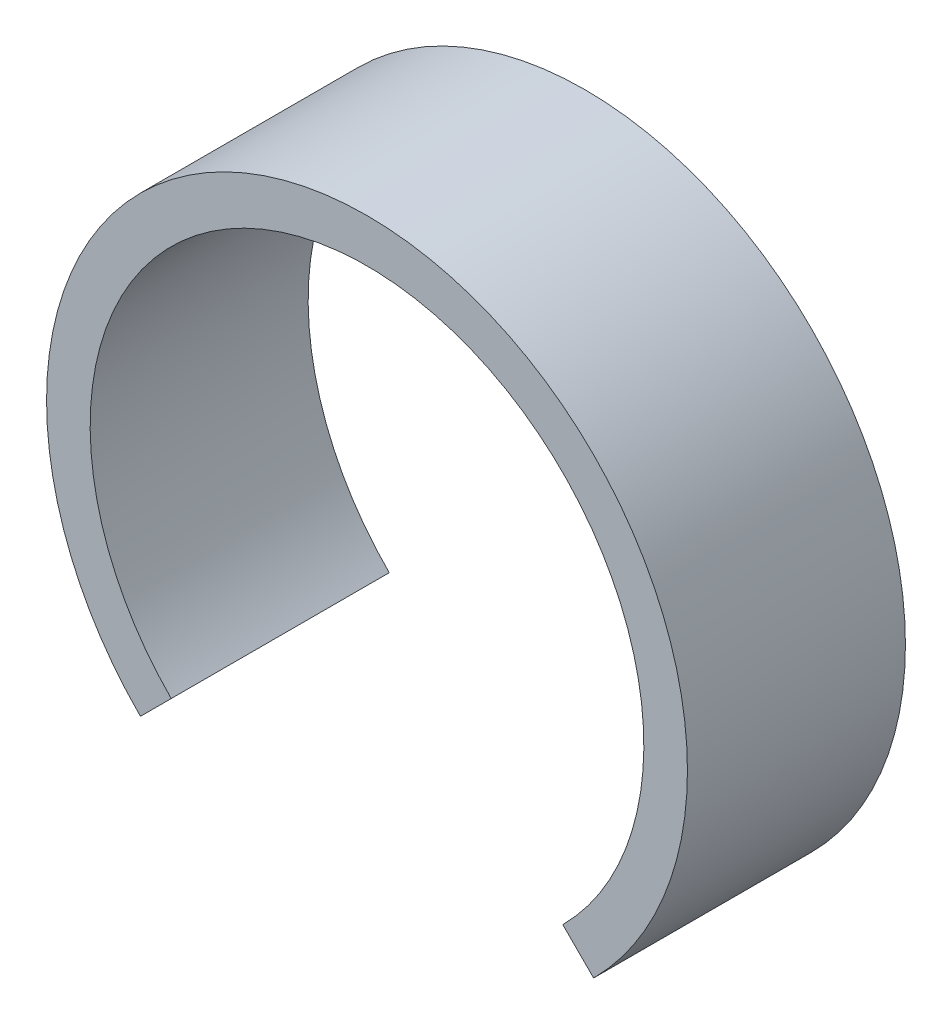
ISO-10303-21;
HEADER;
FILE_DESCRIPTION(('STEP AP214'),'2;1');
FILE_NAME('part.step','',(''),(''),'','','');
FILE_SCHEMA(('AUTOMOTIVE_DESIGN { 1 0 10303 214 1 1 1 1 }'));
ENDSEC;
DATA;
#1=APPLICATION_CONTEXT('core data for automotive mechanical design processes');
#2=APPLICATION_PROTOCOL_DEFINITION('international standard','automotive_design',2000,#1);
#3=PRODUCT_CONTEXT('',#1,'mechanical');
#4=PRODUCT('Part','Part','',(#3));
#5=PRODUCT_RELATED_PRODUCT_CATEGORY('part','',(#4));
#6=PRODUCT_DEFINITION_FORMATION('','',#4);
#7=PRODUCT_DEFINITION_CONTEXT('part definition',#1,'design');
#8=PRODUCT_DEFINITION('design','',#6,#7);
#9=PRODUCT_DEFINITION_SHAPE('','',#8);
#10=(LENGTH_UNIT() NAMED_UNIT(*) SI_UNIT(.MILLI.,.METRE.));
#11=(NAMED_UNIT(*) PLANE_ANGLE_UNIT() SI_UNIT($,.RADIAN.));
#12=(NAMED_UNIT(*) SI_UNIT($,.STERADIAN.) SOLID_ANGLE_UNIT());
#13=UNCERTAINTY_MEASURE_WITH_UNIT(LENGTH_MEASURE(1.E-05),#10,'distance_accuracy_value','');
#14=(GEOMETRIC_REPRESENTATION_CONTEXT(3) GLOBAL_UNCERTAINTY_ASSIGNED_CONTEXT((#13)) GLOBAL_UNIT_ASSIGNED_CONTEXT((#10,
#11,#12)) REPRESENTATION_CONTEXT('',''));
#15=CARTESIAN_POINT('',(0.,0.,0.));
#16=DIRECTION('',(0.,0.,1.));
#17=DIRECTION('',(1.,0.,0.));
#18=AXIS2_PLACEMENT_3D('',#15,#16,#17);
#19=CARTESIAN_POINT('',(0.,0.,10.));
#20=DIRECTION('',(0.707106781186546,0.707106781186549,0.));
#21=DIRECTION('',(-0.707106781186549,0.707106781186546,0.));
#22=AXIS2_PLACEMENT_3D('',#19,#20,#21);
#23=PLANE('',#22);
#24=DIRECTION('',(0.707106781186549,-0.707106781186546,0.));
#25=VECTOR('',#24,1.);
#26=CARTESIAN_POINT('',(0.,0.,0.));
#27=LINE('',#26,#25);
#28=CARTESIAN_POINT('',(8.98025612106917,-8.98025612106914,0.));
#29=VERTEX_POINT('',#28);
#30=CARTESIAN_POINT('',(10.3944696834423,-10.3944696834422,0.));
#31=VERTEX_POINT('',#30);
#32=EDGE_CURVE('E109',#29,#31,#27,.T.);
#33=ORIENTED_EDGE('',*,*,#32,.T.);
#34=DIRECTION('',(0.,0.,-1.));
#35=VECTOR('',#34,1.);
#36=CARTESIAN_POINT('',(10.3944696834423,-10.3944696834422,10.));
#37=LINE('',#36,#35);
#38=CARTESIAN_POINT('',(10.3944696834423,-10.3944696834422,10.));
#39=VERTEX_POINT('',#38);
#40=EDGE_CURVE('E11',#39,#31,#37,.T.);
#41=ORIENTED_EDGE('',*,*,#40,.F.);
#42=DIRECTION('',(0.707106781186549,-0.707106781186546,0.));
#43=VECTOR('',#42,1.);
#44=CARTESIAN_POINT('',(0.,0.,10.));
#45=LINE('',#44,#43);
#46=CARTESIAN_POINT('',(8.98025612106917,-8.98025612106914,10.));
#47=VERTEX_POINT('',#46);
#48=EDGE_CURVE('E91',#47,#39,#45,.T.);
#49=ORIENTED_EDGE('',*,*,#48,.F.);
#50=DIRECTION('',(0.,0.,-1.));
#51=VECTOR('',#50,1.);
#52=CARTESIAN_POINT('',(8.98025612106917,-8.98025612106914,10.));
#53=LINE('',#52,#51);
#54=EDGE_CURVE('E58',#47,#29,#53,.T.);
#55=ORIENTED_EDGE('',*,*,#54,.T.);
#56=EDGE_LOOP('',(#33,#41,#49,#55));
#57=FACE_BOUND('',#56,.T.);
#58=ADVANCED_FACE('F41',(#57),#23,.F.);
#59=CARTESIAN_POINT('',(0.,0.,10.));
#60=DIRECTION('',(0.,0.,-1.));
#61=DIRECTION('',(-1.,0.,0.));
#62=AXIS2_PLACEMENT_3D('',#59,#60,#61);
#63=CYLINDRICAL_SURFACE('',#62,14.7);
#64=CARTESIAN_POINT('',(0.,0.,0.));
#65=DIRECTION('',(0.,0.,1.));
#66=DIRECTION('',(1.,0.,0.));
#67=AXIS2_PLACEMENT_3D('',#64,#65,#66);
#68=CIRCLE('',#67,14.7);
#69=CARTESIAN_POINT('',(-10.3944696834423,-10.3944696834422,0.));
#70=VERTEX_POINT('',#69);
#71=EDGE_CURVE('E97',#31,#70,#68,.T.);
#72=ORIENTED_EDGE('',*,*,#71,.T.);
#73=DIRECTION('',(0.,0.,-1.));
#74=VECTOR('',#73,1.);
#75=CARTESIAN_POINT('',(-10.3944696834423,-10.3944696834422,10.));
#76=LINE('',#75,#74);
#77=CARTESIAN_POINT('',(-10.3944696834423,-10.3944696834422,10.));
#78=VERTEX_POINT('',#77);
#79=EDGE_CURVE('E50',#78,#70,#76,.T.);
#80=ORIENTED_EDGE('',*,*,#79,.F.);
#81=CARTESIAN_POINT('',(0.,0.,10.));
#82=DIRECTION('',(0.,0.,1.));
#83=DIRECTION('',(1.,0.,0.));
#84=AXIS2_PLACEMENT_3D('',#81,#82,#83);
#85=CIRCLE('',#84,14.7);
#86=EDGE_CURVE('E83',#39,#78,#85,.T.);
#87=ORIENTED_EDGE('',*,*,#86,.F.);
#88=ORIENTED_EDGE('',*,*,#40,.T.);
#89=EDGE_LOOP('',(#72,#80,#87,#88));
#90=FACE_BOUND('',#89,.T.);
#91=ADVANCED_FACE('F96',(#90),#63,.T.);
#92=CARTESIAN_POINT('',(0.,0.,10.));
#93=DIRECTION('',(0.707106781186546,-0.707106781186549,0.));
#94=DIRECTION('',(0.707106781186549,0.707106781186546,0.));
#95=AXIS2_PLACEMENT_3D('',#92,#93,#94);
#96=PLANE('',#95);
#97=DIRECTION('',(-0.707106781186549,-0.707106781186546,0.));
#98=VECTOR('',#97,1.);
#99=CARTESIAN_POINT('',(0.,0.,0.));
#100=LINE('',#99,#98);
#101=CARTESIAN_POINT('',(-8.98025612106917,-8.98025612106914,0.));
#102=VERTEX_POINT('',#101);
#103=EDGE_CURVE('E114',#102,#70,#100,.T.);
#104=ORIENTED_EDGE('',*,*,#103,.F.);
#105=DIRECTION('',(0.,0.,-1.));
#106=VECTOR('',#105,1.);
#107=CARTESIAN_POINT('',(-8.98025612106917,-8.98025612106914,10.));
#108=LINE('',#107,#106);
#109=CARTESIAN_POINT('',(-8.98025612106917,-8.98025612106914,10.));
#110=VERTEX_POINT('',#109);
#111=EDGE_CURVE('E72',#110,#102,#108,.T.);
#112=ORIENTED_EDGE('',*,*,#111,.F.);
#113=DIRECTION('',(-0.707106781186549,-0.707106781186546,0.));
#114=VECTOR('',#113,1.);
#115=CARTESIAN_POINT('',(0.,0.,10.));
#116=LINE('',#115,#114);
#117=EDGE_CURVE('E90',#110,#78,#116,.T.);
#118=ORIENTED_EDGE('',*,*,#117,.T.);
#119=ORIENTED_EDGE('',*,*,#79,.T.);
#120=EDGE_LOOP('',(#104,#112,#118,#119));
#121=FACE_BOUND('',#120,.T.);
#122=ADVANCED_FACE('F101',(#121),#96,.T.);
#123=CARTESIAN_POINT('',(0.,0.,10.));
#124=DIRECTION('',(0.,0.,-1.));
#125=DIRECTION('',(-1.,0.,0.));
#126=AXIS2_PLACEMENT_3D('',#123,#124,#125);
#127=CYLINDRICAL_SURFACE('',#126,12.7);
#128=CARTESIAN_POINT('',(0.,0.,0.));
#129=DIRECTION('',(0.,0.,1.));
#130=DIRECTION('',(1.,0.,0.));
#131=AXIS2_PLACEMENT_3D('',#128,#129,#130);
#132=CIRCLE('',#131,12.7);
#133=EDGE_CURVE('E117',#29,#102,#132,.T.);
#134=ORIENTED_EDGE('',*,*,#133,.F.);
#135=ORIENTED_EDGE('',*,*,#54,.F.);
#136=CARTESIAN_POINT('',(0.,0.,10.));
#137=DIRECTION('',(0.,0.,1.));
#138=DIRECTION('',(1.,0.,0.));
#139=AXIS2_PLACEMENT_3D('',#136,#137,#138);
#140=CIRCLE('',#139,12.7);
#141=EDGE_CURVE('E103',#47,#110,#140,.T.);
#142=ORIENTED_EDGE('',*,*,#141,.T.);
#143=ORIENTED_EDGE('',*,*,#111,.T.);
#144=EDGE_LOOP('',(#134,#135,#142,#143));
#145=FACE_BOUND('',#144,.T.);
#146=ADVANCED_FACE('F127',(#145),#127,.F.);
#147=CARTESIAN_POINT('',(0.,0.,10.));
#148=DIRECTION('',(0.,0.,1.));
#149=DIRECTION('',(1.,0.,0.));
#150=AXIS2_PLACEMENT_3D('',#147,#148,#149);
#151=PLANE('',#150);
#152=ORIENTED_EDGE('',*,*,#48,.T.);
#153=ORIENTED_EDGE('',*,*,#86,.T.);
#154=ORIENTED_EDGE('',*,*,#117,.F.);
#155=ORIENTED_EDGE('',*,*,#141,.F.);
#156=EDGE_LOOP('',(#152,#153,#154,#155));
#157=FACE_BOUND('',#156,.T.);
#158=ADVANCED_FACE('F87',(#157),#151,.T.);
#159=CARTESIAN_POINT('',(0.,0.,0.));
#160=DIRECTION('',(0.,0.,1.));
#161=DIRECTION('',(1.,0.,0.));
#162=AXIS2_PLACEMENT_3D('',#159,#160,#161);
#163=PLANE('',#162);
#164=ORIENTED_EDGE('',*,*,#32,.F.);
#165=ORIENTED_EDGE('',*,*,#133,.T.);
#166=ORIENTED_EDGE('',*,*,#103,.T.);
#167=ORIENTED_EDGE('',*,*,#71,.F.);
#168=EDGE_LOOP('',(#164,#165,#166,#167));
#169=FACE_BOUND('',#168,.T.);
#170=ADVANCED_FACE('F126',(#169),#163,.F.);
#171=CLOSED_SHELL('',(#58,#91,#122,#146,#158,#170));
#172=MANIFOLD_SOLID_BREP('B2',#171);
#173=ADVANCED_BREP_SHAPE_REPRESENTATION('',(#18,#172),#14);
#174=SHAPE_DEFINITION_REPRESENTATION(#9,#173);
ENDSEC;
END-ISO-10303-21;
